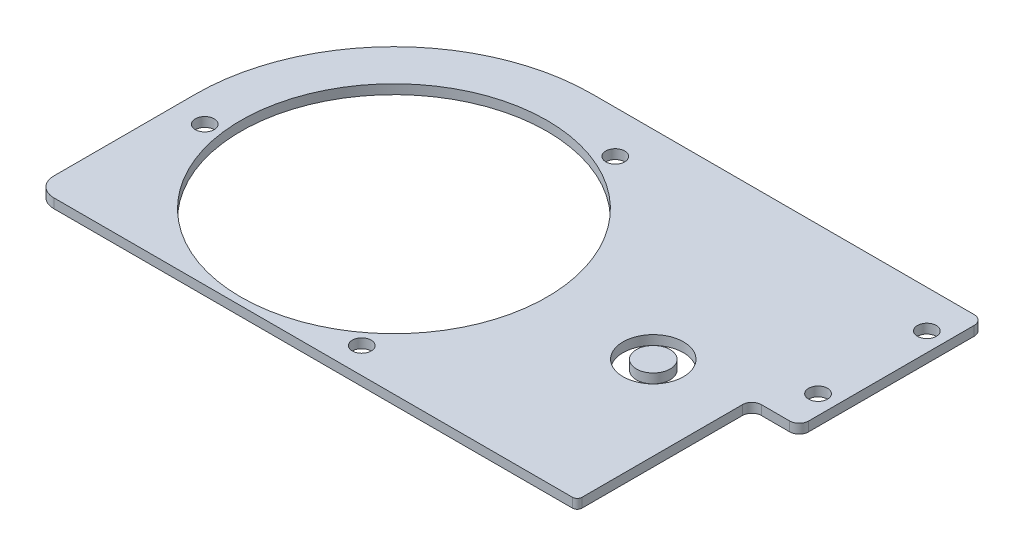
ISO-10303-21;
HEADER;
FILE_DESCRIPTION(('STEP AP214'),'2;1');
FILE_NAME('part.step','',(''),(''),'','','');
FILE_SCHEMA(('AUTOMOTIVE_DESIGN { 1 0 10303 214 1 1 1 1 }'));
ENDSEC;
DATA;
#1=APPLICATION_CONTEXT('core data for automotive mechanical design processes');
#2=APPLICATION_PROTOCOL_DEFINITION('international standard','automotive_design',2000,#1);
#3=PRODUCT_CONTEXT('',#1,'mechanical');
#4=PRODUCT('Part','Part','',(#3));
#5=PRODUCT_RELATED_PRODUCT_CATEGORY('part','',(#4));
#6=PRODUCT_DEFINITION_FORMATION('','',#4);
#7=PRODUCT_DEFINITION_CONTEXT('part definition',#1,'design');
#8=PRODUCT_DEFINITION('design','',#6,#7);
#9=PRODUCT_DEFINITION_SHAPE('','',#8);
#10=(LENGTH_UNIT() NAMED_UNIT(*) SI_UNIT(.MILLI.,.METRE.));
#11=(NAMED_UNIT(*) PLANE_ANGLE_UNIT() SI_UNIT($,.RADIAN.));
#12=(NAMED_UNIT(*) SI_UNIT($,.STERADIAN.) SOLID_ANGLE_UNIT());
#13=UNCERTAINTY_MEASURE_WITH_UNIT(LENGTH_MEASURE(1.E-05),#10,'distance_accuracy_value','');
#14=(GEOMETRIC_REPRESENTATION_CONTEXT(3) GLOBAL_UNCERTAINTY_ASSIGNED_CONTEXT((#13)) GLOBAL_UNIT_ASSIGNED_CONTEXT((#10,
#11,#12)) REPRESENTATION_CONTEXT('',''));
#15=CARTESIAN_POINT('',(0.,0.,0.));
#16=DIRECTION('',(0.,0.,1.));
#17=DIRECTION('',(1.,0.,0.));
#18=AXIS2_PLACEMENT_3D('',#15,#16,#17);
#19=CARTESIAN_POINT('',(-120.668920929197,6.35,95.2310790708027));
#20=DIRECTION('',(0.,-1.,0.));
#21=DIRECTION('',(0.,0.,-1.));
#22=AXIS2_PLACEMENT_3D('',#19,#20,#21);
#23=PLANE('',#22);
#24=CARTESIAN_POINT('',(68.8184042889801,6.35,90.4470456369459));
#25=DIRECTION('',(0.,1.,0.));
#26=DIRECTION('',(0.,0.,1.));
#27=AXIS2_PLACEMENT_3D('',#24,#25,#26);
#28=CIRCLE('',#27,6.35000000000515);
#29=CARTESIAN_POINT('',(68.8184042889801,6.35,96.7970456369511));
#30=VERTEX_POINT('',#29);
#31=EDGE_CURVE('E52',#30,#30,#28,.T.);
#32=ORIENTED_EDGE('',*,*,#31,.F.);
#33=EDGE_LOOP('',(#32));
#34=FACE_BOUND('',#33,.T.);
#35=CARTESIAN_POINT('',(43.9202370743556,6.35,-104.822009180638));
#36=DIRECTION('',(0.,1.,0.));
#37=DIRECTION('',(0.,0.,1.));
#38=AXIS2_PLACEMENT_3D('',#35,#36,#37);
#39=CIRCLE('',#38,6.35000000000716);
#40=CARTESIAN_POINT('',(43.9202370743556,6.35,-98.4720091806305));
#41=VERTEX_POINT('',#40);
#42=EDGE_CURVE('E188',#41,#41,#39,.T.);
#43=ORIENTED_EDGE('',*,*,#42,.F.);
#44=EDGE_LOOP('',(#43));
#45=FACE_BOUND('',#44,.T.);
#46=CARTESIAN_POINT('',(250.171079070803,6.35,-34.8507771089668));
#47=DIRECTION('',(0.,1.,0.));
#48=DIRECTION('',(0.,0.,1.));
#49=AXIS2_PLACEMENT_3D('',#46,#47,#48);
#50=CIRCLE('',#49,6.34999999999993);
#51=CARTESIAN_POINT('',(250.171079070803,6.35,-28.5007771089669));
#52=VERTEX_POINT('',#51);
#53=EDGE_CURVE('E182',#52,#52,#50,.T.);
#54=ORIENTED_EDGE('',*,*,#53,.F.);
#55=EDGE_LOOP('',(#54));
#56=FACE_BOUND('',#55,.T.);
#57=CARTESIAN_POINT('',(250.171079070803,6.35,-107.968920929197));
#58=DIRECTION('',(0.,1.,0.));
#59=DIRECTION('',(0.,0.,1.));
#60=AXIS2_PLACEMENT_3D('',#57,#58,#59);
#61=CIRCLE('',#60,6.34999999999999);
#62=CARTESIAN_POINT('',(250.171079070803,6.35,-101.618920929198));
#63=VERTEX_POINT('',#62);
#64=EDGE_CURVE('E176',#63,#63,#61,.T.);
#65=ORIENTED_EDGE('',*,*,#64,.F.);
#66=EDGE_LOOP('',(#65));
#67=FACE_BOUND('',#66,.T.);
#68=CARTESIAN_POINT('',(-112.738641363336,6.35,14.3749635436917));
#69=DIRECTION('',(0.,1.,0.));
#70=DIRECTION('',(0.,0.,1.));
#71=AXIS2_PLACEMENT_3D('',#68,#69,#70);
#72=CIRCLE('',#71,6.34999999998765);
#73=CARTESIAN_POINT('',(-112.738641363336,6.35,20.7249635436794));
#74=VERTEX_POINT('',#73);
#75=EDGE_CURVE('E169',#74,#74,#72,.T.);
#76=ORIENTED_EDGE('',*,*,#75,.F.);
#77=EDGE_LOOP('',(#76));
#78=FACE_BOUND('',#77,.T.);
#79=CARTESIAN_POINT('',(0.,6.35,0.));
#80=DIRECTION('',(0.,1.,0.));
#81=DIRECTION('',(0.,0.,1.));
#82=AXIS2_PLACEMENT_3D('',#79,#80,#81);
#83=CIRCLE('',#82,102.87);
#84=CARTESIAN_POINT('',(0.,6.35,102.87));
#85=VERTEX_POINT('',#84);
#86=EDGE_CURVE('E166',#85,#85,#83,.T.);
#87=ORIENTED_EDGE('',*,*,#86,.F.);
#88=EDGE_LOOP('',(#87));
#89=FACE_BOUND('',#88,.T.);
#90=CARTESIAN_POINT('',(-120.668920929197,6.35,95.2310790708027));
#91=DIRECTION('',(0.,1.,0.));
#92=DIRECTION('',(0.,0.,-1.));
#93=AXIS2_PLACEMENT_3D('',#90,#91,#92);
#94=CIRCLE('',#93,12.7);
#95=CARTESIAN_POINT('',(-133.368920929197,6.35,95.2310790708027));
#96=VERTEX_POINT('',#95);
#97=CARTESIAN_POINT('',(-120.668920929197,6.35,107.931079070803));
#98=VERTEX_POINT('',#97);
#99=EDGE_CURVE('E136',#96,#98,#94,.T.);
#100=ORIENTED_EDGE('',*,*,#99,.T.);
#101=DIRECTION('',(1.,0.,0.));
#102=VECTOR('',#101,1.);
#103=CARTESIAN_POINT('',(227.955539535401,6.35,107.931079070803));
#104=LINE('',#103,#102);
#105=CARTESIAN_POINT('',(227.955539535401,6.35,107.931079070803));
#106=VERTEX_POINT('',#105);
#107=EDGE_CURVE('E129',#98,#106,#104,.T.);
#108=ORIENTED_EDGE('',*,*,#107,.T.);
#109=CARTESIAN_POINT('',(227.955539535401,6.35,104.765539535401));
#110=DIRECTION('',(0.,1.,0.));
#111=DIRECTION('',(0.,0.,1.));
#112=AXIS2_PLACEMENT_3D('',#109,#110,#111);
#113=CIRCLE('',#112,3.16553953540139);
#114=CARTESIAN_POINT('',(231.121079070803,6.35,104.765539535401));
#115=VERTEX_POINT('',#114);
#116=EDGE_CURVE('E133',#106,#115,#113,.T.);
#117=ORIENTED_EDGE('',*,*,#116,.T.);
#118=DIRECTION('',(0.,0.,-1.));
#119=VECTOR('',#118,1.);
#120=CARTESIAN_POINT('',(231.121079070803,6.35,104.765539535401));
#121=LINE('',#120,#119);
#122=CARTESIAN_POINT('',(231.121079070803,6.35,-3.1007771089668));
#123=VERTEX_POINT('',#122);
#124=EDGE_CURVE('E154',#115,#123,#121,.T.);
#125=ORIENTED_EDGE('',*,*,#124,.T.);
#126=CARTESIAN_POINT('',(237.471079070803,6.35,-3.1007771089668));
#127=DIRECTION('',(0.,-1.,0.));
#128=DIRECTION('',(0.,0.,1.));
#129=AXIS2_PLACEMENT_3D('',#126,#127,#128);
#130=CIRCLE('',#129,6.35);
#131=CARTESIAN_POINT('',(237.471079070803,6.35,-9.4507771089668));
#132=VERTEX_POINT('',#131);
#133=EDGE_CURVE('E156',#123,#132,#130,.T.);
#134=ORIENTED_EDGE('',*,*,#133,.T.);
#135=DIRECTION('',(1.,0.,0.));
#136=VECTOR('',#135,1.);
#137=CARTESIAN_POINT('',(237.471079070803,6.35,-9.4507771089668));
#138=LINE('',#137,#136);
#139=CARTESIAN_POINT('',(256.521079070803,6.35,-9.4507771089668));
#140=VERTEX_POINT('',#139);
#141=EDGE_CURVE('E258',#132,#140,#138,.T.);
#142=ORIENTED_EDGE('',*,*,#141,.T.);
#143=CARTESIAN_POINT('',(256.521079070803,6.35,-15.8007771089668));
#144=DIRECTION('',(0.,1.,0.));
#145=DIRECTION('',(0.,0.,-1.));
#146=AXIS2_PLACEMENT_3D('',#143,#144,#145);
#147=CIRCLE('',#146,6.35000000000001);
#148=CARTESIAN_POINT('',(262.871079070803,6.35,-15.8007771089668));
#149=VERTEX_POINT('',#148);
#150=EDGE_CURVE('E256',#140,#149,#147,.T.);
#151=ORIENTED_EDGE('',*,*,#150,.T.);
#152=DIRECTION('',(0.,0.,-1.));
#153=VECTOR('',#152,1.);
#154=CARTESIAN_POINT('',(262.871079070803,6.35,-127.018920929198));
#155=LINE('',#154,#153);
#156=CARTESIAN_POINT('',(262.871079070803,6.35,-127.018920929198));
#157=VERTEX_POINT('',#156);
#158=EDGE_CURVE('E254',#149,#157,#155,.T.);
#159=ORIENTED_EDGE('',*,*,#158,.T.);
#160=CARTESIAN_POINT('',(256.521079070803,6.35,-127.018920929198));
#161=DIRECTION('',(0.,1.,0.));
#162=DIRECTION('',(0.,0.,-1.));
#163=AXIS2_PLACEMENT_3D('',#160,#161,#162);
#164=CIRCLE('',#163,6.34999999999997);
#165=CARTESIAN_POINT('',(256.521079070803,6.35,-133.368920929197));
#166=VERTEX_POINT('',#165);
#167=EDGE_CURVE('E252',#157,#166,#164,.T.);
#168=ORIENTED_EDGE('',*,*,#167,.T.);
#169=DIRECTION('',(-1.,0.,0.));
#170=VECTOR('',#169,1.);
#171=CARTESIAN_POINT('',(256.521079070803,6.35,-133.368920929197));
#172=LINE('',#171,#170);
#173=CARTESIAN_POINT('',(0.,6.35,-133.368920929197));
#174=VERTEX_POINT('',#173);
#175=EDGE_CURVE('E250',#166,#174,#172,.T.);
#176=ORIENTED_EDGE('',*,*,#175,.T.);
#177=CARTESIAN_POINT('',(0.,6.35,0.));
#178=DIRECTION('',(0.,1.,0.));
#179=DIRECTION('',(0.,0.,-1.));
#180=AXIS2_PLACEMENT_3D('',#177,#178,#179);
#181=CIRCLE('',#180,133.368920929197);
#182=CARTESIAN_POINT('',(-133.368920929197,6.35,0.));
#183=VERTEX_POINT('',#182);
#184=EDGE_CURVE('E248',#174,#183,#181,.T.);
#185=ORIENTED_EDGE('',*,*,#184,.T.);
#186=DIRECTION('',(0.,0.,1.));
#187=VECTOR('',#186,1.);
#188=CARTESIAN_POINT('',(-133.368920929197,6.35,0.));
#189=LINE('',#188,#187);
#190=EDGE_CURVE('E191',#183,#96,#189,.T.);
#191=ORIENTED_EDGE('',*,*,#190,.T.);
#192=EDGE_LOOP('',(#100,#108,#117,#125,#134,#142,#151,#159,#168,#176,#185,#191));
#193=FACE_BOUND('',#192,.T.);
#194=CARTESIAN_POINT('',(174.751369452698,6.35,0.46944478550498));
#195=DIRECTION('',(0.,-1.,0.));
#196=DIRECTION('',(0.,0.,-1.));
#197=AXIS2_PLACEMENT_3D('',#194,#195,#196);
#198=CIRCLE('',#197,20.32);
#199=CARTESIAN_POINT('',(174.751369452698,6.35,-19.850555214495));
#200=VERTEX_POINT('',#199);
#201=EDGE_CURVE('E12',#200,#200,#198,.F.);
#202=ORIENTED_EDGE('',*,*,#201,.F.);
#203=EDGE_LOOP('',(#202));
#204=FACE_BOUND('',#203,.T.);
#205=ADVANCED_FACE('F43',(#34,#45,#56,#67,#78,#89,#193,#204),#23,.F.);
#206=CARTESIAN_POINT('',(-120.668920929197,0.,95.2310790708027));
#207=DIRECTION('',(0.,-1.,0.));
#208=DIRECTION('',(0.,0.,-1.));
#209=AXIS2_PLACEMENT_3D('',#206,#207,#208);
#210=PLANE('',#209);
#211=CARTESIAN_POINT('',(43.9202370743556,0.,-104.822009180638));
#212=DIRECTION('',(0.,1.,0.));
#213=DIRECTION('',(0.,0.,1.));
#214=AXIS2_PLACEMENT_3D('',#211,#212,#213);
#215=CIRCLE('',#214,6.35000000000716);
#216=CARTESIAN_POINT('',(43.9202370743556,0.,-98.4720091806305));
#217=VERTEX_POINT('',#216);
#218=EDGE_CURVE('E179',#217,#217,#215,.T.);
#219=ORIENTED_EDGE('',*,*,#218,.T.);
#220=EDGE_LOOP('',(#219));
#221=FACE_BOUND('',#220,.T.);
#222=CARTESIAN_POINT('',(250.171079070803,0.,-107.968920929197));
#223=DIRECTION('',(0.,1.,0.));
#224=DIRECTION('',(0.,0.,1.));
#225=AXIS2_PLACEMENT_3D('',#222,#223,#224);
#226=CIRCLE('',#225,6.34999999999999);
#227=CARTESIAN_POINT('',(250.171079070803,0.,-101.618920929198));
#228=VERTEX_POINT('',#227);
#229=EDGE_CURVE('E165',#228,#228,#226,.T.);
#230=ORIENTED_EDGE('',*,*,#229,.T.);
#231=EDGE_LOOP('',(#230));
#232=FACE_BOUND('',#231,.T.);
#233=CARTESIAN_POINT('',(0.,0.,0.));
#234=DIRECTION('',(0.,1.,0.));
#235=DIRECTION('',(0.,0.,1.));
#236=AXIS2_PLACEMENT_3D('',#233,#234,#235);
#237=CIRCLE('',#236,102.87);
#238=CARTESIAN_POINT('',(0.,0.,102.87));
#239=VERTEX_POINT('',#238);
#240=EDGE_CURVE('E161',#239,#239,#237,.T.);
#241=ORIENTED_EDGE('',*,*,#240,.T.);
#242=EDGE_LOOP('',(#241));
#243=FACE_BOUND('',#242,.T.);
#244=CARTESIAN_POINT('',(-120.668920929197,0.,95.2310790708027));
#245=DIRECTION('',(0.,1.,0.));
#246=DIRECTION('',(0.,0.,-1.));
#247=AXIS2_PLACEMENT_3D('',#244,#245,#246);
#248=CIRCLE('',#247,12.7);
#249=CARTESIAN_POINT('',(-133.368920929197,0.,95.2310790708027));
#250=VERTEX_POINT('',#249);
#251=CARTESIAN_POINT('',(-120.668920929197,0.,107.931079070803));
#252=VERTEX_POINT('',#251);
#253=EDGE_CURVE('E230',#250,#252,#248,.T.);
#254=ORIENTED_EDGE('',*,*,#253,.F.);
#255=DIRECTION('',(0.,0.,1.));
#256=VECTOR('',#255,1.);
#257=CARTESIAN_POINT('',(-133.368920929197,0.,0.));
#258=LINE('',#257,#256);
#259=CARTESIAN_POINT('',(-133.368920929197,0.,0.));
#260=VERTEX_POINT('',#259);
#261=EDGE_CURVE('E60',#260,#250,#258,.T.);
#262=ORIENTED_EDGE('',*,*,#261,.F.);
#263=CARTESIAN_POINT('',(0.,0.,0.));
#264=DIRECTION('',(0.,1.,0.));
#265=DIRECTION('',(0.,0.,-1.));
#266=AXIS2_PLACEMENT_3D('',#263,#264,#265);
#267=CIRCLE('',#266,133.368920929197);
#268=CARTESIAN_POINT('',(0.,0.,-133.368920929197));
#269=VERTEX_POINT('',#268);
#270=EDGE_CURVE('E308',#269,#260,#267,.T.);
#271=ORIENTED_EDGE('',*,*,#270,.F.);
#272=DIRECTION('',(-1.,0.,0.));
#273=VECTOR('',#272,1.);
#274=CARTESIAN_POINT('',(256.521079070803,0.,-133.368920929197));
#275=LINE('',#274,#273);
#276=CARTESIAN_POINT('',(256.521079070803,0.,-133.368920929197));
#277=VERTEX_POINT('',#276);
#278=EDGE_CURVE('E299',#277,#269,#275,.T.);
#279=ORIENTED_EDGE('',*,*,#278,.F.);
#280=CARTESIAN_POINT('',(256.521079070803,0.,-127.018920929198));
#281=DIRECTION('',(0.,1.,0.));
#282=DIRECTION('',(0.,0.,-1.));
#283=AXIS2_PLACEMENT_3D('',#280,#281,#282);
#284=CIRCLE('',#283,6.34999999999997);
#285=CARTESIAN_POINT('',(262.871079070803,0.,-127.018920929198));
#286=VERTEX_POINT('',#285);
#287=EDGE_CURVE('E300',#286,#277,#284,.T.);
#288=ORIENTED_EDGE('',*,*,#287,.F.);
#289=DIRECTION('',(0.,0.,-1.));
#290=VECTOR('',#289,1.);
#291=CARTESIAN_POINT('',(262.871079070803,0.,-127.018920929198));
#292=LINE('',#291,#290);
#293=CARTESIAN_POINT('',(262.871079070803,0.,-15.8007771089668));
#294=VERTEX_POINT('',#293);
#295=EDGE_CURVE('E282',#294,#286,#292,.T.);
#296=ORIENTED_EDGE('',*,*,#295,.F.);
#297=CARTESIAN_POINT('',(256.521079070803,0.,-15.8007771089668));
#298=DIRECTION('',(0.,1.,0.));
#299=DIRECTION('',(0.,0.,-1.));
#300=AXIS2_PLACEMENT_3D('',#297,#298,#299);
#301=CIRCLE('',#300,6.35000000000001);
#302=CARTESIAN_POINT('',(256.521079070803,0.,-9.4507771089668));
#303=VERTEX_POINT('',#302);
#304=EDGE_CURVE('E273',#303,#294,#301,.T.);
#305=ORIENTED_EDGE('',*,*,#304,.F.);
#306=DIRECTION('',(1.,0.,0.));
#307=VECTOR('',#306,1.);
#308=CARTESIAN_POINT('',(237.471079070803,0.,-9.4507771089668));
#309=LINE('',#308,#307);
#310=CARTESIAN_POINT('',(237.471079070803,0.,-9.4507771089668));
#311=VERTEX_POINT('',#310);
#312=EDGE_CURVE('E274',#311,#303,#309,.T.);
#313=ORIENTED_EDGE('',*,*,#312,.F.);
#314=CARTESIAN_POINT('',(237.471079070803,0.,-3.1007771089668));
#315=DIRECTION('',(0.,-1.,0.));
#316=DIRECTION('',(0.,0.,1.));
#317=AXIS2_PLACEMENT_3D('',#314,#315,#316);
#318=CIRCLE('',#317,6.35);
#319=CARTESIAN_POINT('',(231.121079070803,0.,-3.1007771089668));
#320=VERTEX_POINT('',#319);
#321=EDGE_CURVE('E270',#320,#311,#318,.T.);
#322=ORIENTED_EDGE('',*,*,#321,.F.);
#323=DIRECTION('',(0.,0.,-1.));
#324=VECTOR('',#323,1.);
#325=CARTESIAN_POINT('',(231.121079070803,0.,104.765539535401));
#326=LINE('',#325,#324);
#327=CARTESIAN_POINT('',(231.121079070803,0.,104.765539535401));
#328=VERTEX_POINT('',#327);
#329=EDGE_CURVE('E147',#328,#320,#326,.T.);
#330=ORIENTED_EDGE('',*,*,#329,.F.);
#331=CARTESIAN_POINT('',(227.955539535401,0.,104.765539535401));
#332=DIRECTION('',(0.,1.,0.));
#333=DIRECTION('',(0.,0.,1.));
#334=AXIS2_PLACEMENT_3D('',#331,#332,#333);
#335=CIRCLE('',#334,3.16553953540139);
#336=CARTESIAN_POINT('',(227.955539535401,0.,107.931079070803));
#337=VERTEX_POINT('',#336);
#338=EDGE_CURVE('E148',#337,#328,#335,.T.);
#339=ORIENTED_EDGE('',*,*,#338,.F.);
#340=DIRECTION('',(1.,0.,0.));
#341=VECTOR('',#340,1.);
#342=CARTESIAN_POINT('',(227.955539535401,0.,107.931079070803));
#343=LINE('',#342,#341);
#344=EDGE_CURVE('E144',#252,#337,#343,.T.);
#345=ORIENTED_EDGE('',*,*,#344,.F.);
#346=EDGE_LOOP('',(#254,#262,#271,#279,#288,#296,#305,#313,#322,#330,#339,#345));
#347=FACE_BOUND('',#346,.T.);
#348=CARTESIAN_POINT('',(-112.738641363336,0.,14.3749635436917));
#349=DIRECTION('',(0.,1.,0.));
#350=DIRECTION('',(0.,0.,1.));
#351=AXIS2_PLACEMENT_3D('',#348,#349,#350);
#352=CIRCLE('',#351,6.34999999998765);
#353=CARTESIAN_POINT('',(-112.738641363336,0.,20.7249635436794));
#354=VERTEX_POINT('',#353);
#355=EDGE_CURVE('E164',#354,#354,#352,.T.);
#356=ORIENTED_EDGE('',*,*,#355,.T.);
#357=EDGE_LOOP('',(#356));
#358=FACE_BOUND('',#357,.T.);
#359=CARTESIAN_POINT('',(250.171079070803,0.,-34.8507771089668));
#360=DIRECTION('',(0.,1.,0.));
#361=DIRECTION('',(0.,0.,1.));
#362=AXIS2_PLACEMENT_3D('',#359,#360,#361);
#363=CIRCLE('',#362,6.34999999999993);
#364=CARTESIAN_POINT('',(250.171079070803,0.,-28.5007771089669));
#365=VERTEX_POINT('',#364);
#366=EDGE_CURVE('E173',#365,#365,#363,.T.);
#367=ORIENTED_EDGE('',*,*,#366,.T.);
#368=EDGE_LOOP('',(#367));
#369=FACE_BOUND('',#368,.T.);
#370=CARTESIAN_POINT('',(68.8184042889801,0.,90.4470456369459));
#371=DIRECTION('',(0.,1.,0.));
#372=DIRECTION('',(0.,0.,1.));
#373=AXIS2_PLACEMENT_3D('',#370,#371,#372);
#374=CIRCLE('',#373,6.35000000000515);
#375=CARTESIAN_POINT('',(68.8184042889801,0.,96.7970456369511));
#376=VERTEX_POINT('',#375);
#377=EDGE_CURVE('E185',#376,#376,#374,.T.);
#378=ORIENTED_EDGE('',*,*,#377,.T.);
#379=EDGE_LOOP('',(#378));
#380=FACE_BOUND('',#379,.T.);
#381=CARTESIAN_POINT('',(174.751369452698,0.,0.46944478550498));
#382=DIRECTION('',(0.,1.,0.));
#383=DIRECTION('',(0.,0.,1.));
#384=AXIS2_PLACEMENT_3D('',#381,#382,#383);
#385=CIRCLE('',#384,20.32);
#386=CARTESIAN_POINT('',(174.751369452698,0.,20.789444785505));
#387=VERTEX_POINT('',#386);
#388=EDGE_CURVE('E46',#387,#387,#385,.T.);
#389=ORIENTED_EDGE('',*,*,#388,.T.);
#390=EDGE_LOOP('',(#389));
#391=FACE_BOUND('',#390,.T.);
#392=ADVANCED_FACE('F204',(#221,#232,#243,#347,#358,#369,#380,#391),#210,.T.);
#393=CARTESIAN_POINT('',(-120.668920929197,6.35,95.2310790708027));
#394=DIRECTION('',(0.,-1.,0.));
#395=DIRECTION('',(0.,0.,-1.));
#396=AXIS2_PLACEMENT_3D('',#393,#394,#395);
#397=CYLINDRICAL_SURFACE('',#396,12.7);
#398=ORIENTED_EDGE('',*,*,#253,.T.);
#399=DIRECTION('',(0.,-1.,0.));
#400=VECTOR('',#399,1.);
#401=CARTESIAN_POINT('',(-120.668920929197,6.35,107.931079070803));
#402=LINE('',#401,#400);
#403=EDGE_CURVE('E321',#98,#252,#402,.T.);
#404=ORIENTED_EDGE('',*,*,#403,.F.);
#405=ORIENTED_EDGE('',*,*,#99,.F.);
#406=DIRECTION('',(0.,-1.,0.));
#407=VECTOR('',#406,1.);
#408=CARTESIAN_POINT('',(-133.368920929197,6.35,95.2310790708027));
#409=LINE('',#408,#407);
#410=EDGE_CURVE('E240',#96,#250,#409,.T.);
#411=ORIENTED_EDGE('',*,*,#410,.T.);
#412=EDGE_LOOP('',(#398,#404,#405,#411));
#413=FACE_BOUND('',#412,.T.);
#414=ADVANCED_FACE('F225',(#413),#397,.T.);
#415=CARTESIAN_POINT('',(227.955539535401,6.35,107.931079070803));
#416=DIRECTION('',(0.,0.,-1.));
#417=DIRECTION('',(-1.,0.,0.));
#418=AXIS2_PLACEMENT_3D('',#415,#416,#417);
#419=PLANE('',#418);
#420=ORIENTED_EDGE('',*,*,#344,.T.);
#421=DIRECTION('',(0.,-1.,0.));
#422=VECTOR('',#421,1.);
#423=CARTESIAN_POINT('',(227.955539535401,6.35,107.931079070803));
#424=LINE('',#423,#422);
#425=EDGE_CURVE('E142',#106,#337,#424,.T.);
#426=ORIENTED_EDGE('',*,*,#425,.F.);
#427=ORIENTED_EDGE('',*,*,#107,.F.);
#428=ORIENTED_EDGE('',*,*,#403,.T.);
#429=EDGE_LOOP('',(#420,#426,#427,#428));
#430=FACE_BOUND('',#429,.T.);
#431=ADVANCED_FACE('F143',(#430),#419,.F.);
#432=CARTESIAN_POINT('',(227.955539535401,6.35,104.765539535401));
#433=DIRECTION('',(0.,-1.,0.));
#434=DIRECTION('',(0.,0.,-1.));
#435=AXIS2_PLACEMENT_3D('',#432,#433,#434);
#436=CYLINDRICAL_SURFACE('',#435,3.16553953540139);
#437=ORIENTED_EDGE('',*,*,#338,.T.);
#438=DIRECTION('',(0.,-1.,0.));
#439=VECTOR('',#438,1.);
#440=CARTESIAN_POINT('',(231.121079070803,6.35,104.765539535401));
#441=LINE('',#440,#439);
#442=EDGE_CURVE('E152',#115,#328,#441,.T.);
#443=ORIENTED_EDGE('',*,*,#442,.F.);
#444=ORIENTED_EDGE('',*,*,#116,.F.);
#445=ORIENTED_EDGE('',*,*,#425,.T.);
#446=EDGE_LOOP('',(#437,#443,#444,#445));
#447=FACE_BOUND('',#446,.T.);
#448=ADVANCED_FACE('F150',(#447),#436,.T.);
#449=CARTESIAN_POINT('',(231.121079070803,6.35,104.765539535401));
#450=DIRECTION('',(-1.,0.,0.));
#451=DIRECTION('',(0.,0.,1.));
#452=AXIS2_PLACEMENT_3D('',#449,#450,#451);
#453=PLANE('',#452);
#454=ORIENTED_EDGE('',*,*,#329,.T.);
#455=DIRECTION('',(0.,-1.,0.));
#456=VECTOR('',#455,1.);
#457=CARTESIAN_POINT('',(231.121079070803,6.35,-3.1007771089668));
#458=LINE('',#457,#456);
#459=EDGE_CURVE('E325',#123,#320,#458,.T.);
#460=ORIENTED_EDGE('',*,*,#459,.F.);
#461=ORIENTED_EDGE('',*,*,#124,.F.);
#462=ORIENTED_EDGE('',*,*,#442,.T.);
#463=EDGE_LOOP('',(#454,#460,#461,#462));
#464=FACE_BOUND('',#463,.T.);
#465=ADVANCED_FACE('F339',(#464),#453,.F.);
#466=CARTESIAN_POINT('',(237.471079070803,6.35,-3.1007771089668));
#467=DIRECTION('',(0.,-1.,0.));
#468=DIRECTION('',(0.,0.,-1.));
#469=AXIS2_PLACEMENT_3D('',#466,#467,#468);
#470=CYLINDRICAL_SURFACE('',#469,6.35);
#471=ORIENTED_EDGE('',*,*,#321,.T.);
#472=DIRECTION('',(0.,-1.,0.));
#473=VECTOR('',#472,1.);
#474=CARTESIAN_POINT('',(237.471079070803,6.35,-9.4507771089668));
#475=LINE('',#474,#473);
#476=EDGE_CURVE('E267',#132,#311,#475,.T.);
#477=ORIENTED_EDGE('',*,*,#476,.F.);
#478=ORIENTED_EDGE('',*,*,#133,.F.);
#479=ORIENTED_EDGE('',*,*,#459,.T.);
#480=EDGE_LOOP('',(#471,#477,#478,#479));
#481=FACE_BOUND('',#480,.T.);
#482=ADVANCED_FACE('F268',(#481),#470,.F.);
#483=CARTESIAN_POINT('',(237.471079070803,6.35,-9.4507771089668));
#484=DIRECTION('',(0.,0.,-1.));
#485=DIRECTION('',(-1.,0.,0.));
#486=AXIS2_PLACEMENT_3D('',#483,#484,#485);
#487=PLANE('',#486);
#488=ORIENTED_EDGE('',*,*,#312,.T.);
#489=DIRECTION('',(0.,-1.,0.));
#490=VECTOR('',#489,1.);
#491=CARTESIAN_POINT('',(256.521079070803,6.35,-9.4507771089668));
#492=LINE('',#491,#490);
#493=EDGE_CURVE('E278',#140,#303,#492,.T.);
#494=ORIENTED_EDGE('',*,*,#493,.F.);
#495=ORIENTED_EDGE('',*,*,#141,.F.);
#496=ORIENTED_EDGE('',*,*,#476,.T.);
#497=EDGE_LOOP('',(#488,#494,#495,#496));
#498=FACE_BOUND('',#497,.T.);
#499=ADVANCED_FACE('F276',(#498),#487,.F.);
#500=CARTESIAN_POINT('',(256.521079070803,6.35,-15.8007771089668));
#501=DIRECTION('',(0.,-1.,0.));
#502=DIRECTION('',(0.,0.,-1.));
#503=AXIS2_PLACEMENT_3D('',#500,#501,#502);
#504=CYLINDRICAL_SURFACE('',#503,6.35000000000001);
#505=ORIENTED_EDGE('',*,*,#304,.T.);
#506=DIRECTION('',(0.,-1.,0.));
#507=VECTOR('',#506,1.);
#508=CARTESIAN_POINT('',(262.871079070803,6.35,-15.8007771089668));
#509=LINE('',#508,#507);
#510=EDGE_CURVE('E287',#149,#294,#509,.T.);
#511=ORIENTED_EDGE('',*,*,#510,.F.);
#512=ORIENTED_EDGE('',*,*,#150,.F.);
#513=ORIENTED_EDGE('',*,*,#493,.T.);
#514=EDGE_LOOP('',(#505,#511,#512,#513));
#515=FACE_BOUND('',#514,.T.);
#516=ADVANCED_FACE('F285',(#515),#504,.T.);
#517=CARTESIAN_POINT('',(262.871079070803,6.35,-127.018920929198));
#518=DIRECTION('',(-1.,0.,0.));
#519=DIRECTION('',(0.,0.,1.));
#520=AXIS2_PLACEMENT_3D('',#517,#518,#519);
#521=PLANE('',#520);
#522=ORIENTED_EDGE('',*,*,#295,.T.);
#523=DIRECTION('',(0.,-1.,0.));
#524=VECTOR('',#523,1.);
#525=CARTESIAN_POINT('',(262.871079070803,6.35,-127.018920929198));
#526=LINE('',#525,#524);
#527=EDGE_CURVE('E294',#157,#286,#526,.T.);
#528=ORIENTED_EDGE('',*,*,#527,.F.);
#529=ORIENTED_EDGE('',*,*,#158,.F.);
#530=ORIENTED_EDGE('',*,*,#510,.T.);
#531=EDGE_LOOP('',(#522,#528,#529,#530));
#532=FACE_BOUND('',#531,.T.);
#533=ADVANCED_FACE('F295',(#532),#521,.F.);
#534=CARTESIAN_POINT('',(256.521079070803,6.35,-127.018920929198));
#535=DIRECTION('',(0.,-1.,0.));
#536=DIRECTION('',(0.,0.,-1.));
#537=AXIS2_PLACEMENT_3D('',#534,#535,#536);
#538=CYLINDRICAL_SURFACE('',#537,6.34999999999997);
#539=ORIENTED_EDGE('',*,*,#287,.T.);
#540=DIRECTION('',(0.,-1.,0.));
#541=VECTOR('',#540,1.);
#542=CARTESIAN_POINT('',(256.521079070803,6.35,-133.368920929197));
#543=LINE('',#542,#541);
#544=EDGE_CURVE('E304',#166,#277,#543,.T.);
#545=ORIENTED_EDGE('',*,*,#544,.F.);
#546=ORIENTED_EDGE('',*,*,#167,.F.);
#547=ORIENTED_EDGE('',*,*,#527,.T.);
#548=EDGE_LOOP('',(#539,#545,#546,#547));
#549=FACE_BOUND('',#548,.T.);
#550=ADVANCED_FACE('F302',(#549),#538,.T.);
#551=CARTESIAN_POINT('',(256.521079070803,6.35,-133.368920929197));
#552=DIRECTION('',(0.,0.,1.));
#553=DIRECTION('',(1.,0.,0.));
#554=AXIS2_PLACEMENT_3D('',#551,#552,#553);
#555=PLANE('',#554);
#556=ORIENTED_EDGE('',*,*,#278,.T.);
#557=DIRECTION('',(0.,-1.,0.));
#558=VECTOR('',#557,1.);
#559=CARTESIAN_POINT('',(0.,6.35,-133.368920929197));
#560=LINE('',#559,#558);
#561=EDGE_CURVE('E313',#174,#269,#560,.T.);
#562=ORIENTED_EDGE('',*,*,#561,.F.);
#563=ORIENTED_EDGE('',*,*,#175,.F.);
#564=ORIENTED_EDGE('',*,*,#544,.T.);
#565=EDGE_LOOP('',(#556,#562,#563,#564));
#566=FACE_BOUND('',#565,.T.);
#567=ADVANCED_FACE('F311',(#566),#555,.F.);
#568=CARTESIAN_POINT('',(0.,6.35,0.));
#569=DIRECTION('',(0.,-1.,0.));
#570=DIRECTION('',(0.,0.,-1.));
#571=AXIS2_PLACEMENT_3D('',#568,#569,#570);
#572=CYLINDRICAL_SURFACE('',#571,133.368920929197);
#573=ORIENTED_EDGE('',*,*,#270,.T.);
#574=DIRECTION('',(0.,-1.,0.));
#575=VECTOR('',#574,1.);
#576=CARTESIAN_POINT('',(-133.368920929197,6.35,0.));
#577=LINE('',#576,#575);
#578=EDGE_CURVE('E170',#183,#260,#577,.T.);
#579=ORIENTED_EDGE('',*,*,#578,.F.);
#580=ORIENTED_EDGE('',*,*,#184,.F.);
#581=ORIENTED_EDGE('',*,*,#561,.T.);
#582=EDGE_LOOP('',(#573,#579,#580,#581));
#583=FACE_BOUND('',#582,.T.);
#584=ADVANCED_FACE('F318',(#583),#572,.T.);
#585=CARTESIAN_POINT('',(-133.368920929197,6.35,0.));
#586=DIRECTION('',(1.,0.,0.));
#587=DIRECTION('',(0.,0.,-1.));
#588=AXIS2_PLACEMENT_3D('',#585,#586,#587);
#589=PLANE('',#588);
#590=ORIENTED_EDGE('',*,*,#261,.T.);
#591=ORIENTED_EDGE('',*,*,#410,.F.);
#592=ORIENTED_EDGE('',*,*,#190,.F.);
#593=ORIENTED_EDGE('',*,*,#578,.T.);
#594=EDGE_LOOP('',(#590,#591,#592,#593));
#595=FACE_BOUND('',#594,.T.);
#596=ADVANCED_FACE('F219',(#595),#589,.F.);
#597=CARTESIAN_POINT('',(0.,6.35,0.));
#598=DIRECTION('',(0.,-1.,0.));
#599=DIRECTION('',(0.,0.,-1.));
#600=AXIS2_PLACEMENT_3D('',#597,#598,#599);
#601=CYLINDRICAL_SURFACE('',#600,102.87);
#602=ORIENTED_EDGE('',*,*,#86,.T.);
#603=EDGE_LOOP('',(#602));
#604=FACE_BOUND('',#603,.T.);
#605=ORIENTED_EDGE('',*,*,#240,.F.);
#606=EDGE_LOOP('',(#605));
#607=FACE_BOUND('',#606,.T.);
#608=ADVANCED_FACE('F215',(#604,#607),#601,.F.);
#609=CARTESIAN_POINT('',(-112.738641363336,6.35,14.3749635436917));
#610=DIRECTION('',(0.,-1.,0.));
#611=DIRECTION('',(0.,0.,-1.));
#612=AXIS2_PLACEMENT_3D('',#609,#610,#611);
#613=CYLINDRICAL_SURFACE('',#612,6.34999999998765);
#614=ORIENTED_EDGE('',*,*,#75,.T.);
#615=EDGE_LOOP('',(#614));
#616=FACE_BOUND('',#615,.T.);
#617=ORIENTED_EDGE('',*,*,#355,.F.);
#618=EDGE_LOOP('',(#617));
#619=FACE_BOUND('',#618,.T.);
#620=ADVANCED_FACE('F218',(#616,#619),#613,.F.);
#621=CARTESIAN_POINT('',(250.171079070803,6.35,-107.968920929197));
#622=DIRECTION('',(0.,-1.,0.));
#623=DIRECTION('',(0.,0.,-1.));
#624=AXIS2_PLACEMENT_3D('',#621,#622,#623);
#625=CYLINDRICAL_SURFACE('',#624,6.34999999999999);
#626=ORIENTED_EDGE('',*,*,#64,.T.);
#627=EDGE_LOOP('',(#626));
#628=FACE_BOUND('',#627,.T.);
#629=ORIENTED_EDGE('',*,*,#229,.F.);
#630=EDGE_LOOP('',(#629));
#631=FACE_BOUND('',#630,.T.);
#632=ADVANCED_FACE('F366',(#628,#631),#625,.F.);
#633=CARTESIAN_POINT('',(250.171079070803,6.35,-34.8507771089668));
#634=DIRECTION('',(0.,-1.,0.));
#635=DIRECTION('',(0.,0.,-1.));
#636=AXIS2_PLACEMENT_3D('',#633,#634,#635);
#637=CYLINDRICAL_SURFACE('',#636,6.34999999999993);
#638=ORIENTED_EDGE('',*,*,#53,.T.);
#639=EDGE_LOOP('',(#638));
#640=FACE_BOUND('',#639,.T.);
#641=ORIENTED_EDGE('',*,*,#366,.F.);
#642=EDGE_LOOP('',(#641));
#643=FACE_BOUND('',#642,.T.);
#644=ADVANCED_FACE('F370',(#640,#643),#637,.F.);
#645=CARTESIAN_POINT('',(43.9202370743556,6.35,-104.822009180638));
#646=DIRECTION('',(0.,-1.,0.));
#647=DIRECTION('',(0.,0.,-1.));
#648=AXIS2_PLACEMENT_3D('',#645,#646,#647);
#649=CYLINDRICAL_SURFACE('',#648,6.35000000000716);
#650=ORIENTED_EDGE('',*,*,#42,.T.);
#651=EDGE_LOOP('',(#650));
#652=FACE_BOUND('',#651,.T.);
#653=ORIENTED_EDGE('',*,*,#218,.F.);
#654=EDGE_LOOP('',(#653));
#655=FACE_BOUND('',#654,.T.);
#656=ADVANCED_FACE('F374',(#652,#655),#649,.F.);
#657=CARTESIAN_POINT('',(68.8184042889801,6.35,90.4470456369459));
#658=DIRECTION('',(0.,-1.,0.));
#659=DIRECTION('',(0.,0.,-1.));
#660=AXIS2_PLACEMENT_3D('',#657,#658,#659);
#661=CYLINDRICAL_SURFACE('',#660,6.35000000000515);
#662=ORIENTED_EDGE('',*,*,#31,.T.);
#663=EDGE_LOOP('',(#662));
#664=FACE_BOUND('',#663,.T.);
#665=ORIENTED_EDGE('',*,*,#377,.F.);
#666=EDGE_LOOP('',(#665));
#667=FACE_BOUND('',#666,.T.);
#668=ADVANCED_FACE('F199',(#664,#667),#661,.F.);
#669=CARTESIAN_POINT('',(174.751369452698,28.448,0.46944478550498));
#670=DIRECTION('',(0.,-1.,0.));
#671=DIRECTION('',(0.,0.,-1.));
#672=AXIS2_PLACEMENT_3D('',#669,#670,#671);
#673=CYLINDRICAL_SURFACE('',#672,20.32);
#674=ORIENTED_EDGE('',*,*,#388,.F.);
#675=EDGE_LOOP('',(#674));
#676=FACE_BOUND('',#675,.T.);
#677=ORIENTED_EDGE('',*,*,#201,.T.);
#678=EDGE_LOOP('',(#677));
#679=FACE_BOUND('',#678,.T.);
#680=ADVANCED_FACE('F381',(#676,#679),#673,.F.);
#681=CLOSED_SHELL('',(#205,#392,#414,#431,#448,#465,#482,#499,#516,#533,#550,#567,#584,#596,
#608,#620,#632,#644,#656,#668,#680));
#682=MANIFOLD_SOLID_BREP('B2',#681);
#683=CARTESIAN_POINT('',(-120.668920929197,0.,95.2310790708027));
#684=DIRECTION('',(0.,-1.,0.));
#685=DIRECTION('',(0.,0.,-1.));
#686=AXIS2_PLACEMENT_3D('',#683,#684,#685);
#687=PLANE('',#686);
#688=CARTESIAN_POINT('',(174.751369452698,0.,0.46944478550498));
#689=DIRECTION('',(0.,1.,0.));
#690=DIRECTION('',(0.,0.,1.));
#691=AXIS2_PLACEMENT_3D('',#688,#689,#690);
#692=CIRCLE('',#691,11.3227513432342);
#693=CARTESIAN_POINT('',(174.751369452698,0.,11.7921961287392));
#694=VERTEX_POINT('',#693);
#695=EDGE_CURVE('E540',#694,#694,#692,.T.);
#696=ORIENTED_EDGE('',*,*,#695,.F.);
#697=EDGE_LOOP('',(#696));
#698=FACE_BOUND('',#697,.T.);
#699=ADVANCED_FACE('F534',(#698),#687,.T.);
#700=CARTESIAN_POINT('',(174.751369452698,28.448,0.46944478550498));
#701=DIRECTION('',(0.,-1.,0.));
#702=DIRECTION('',(0.,0.,-1.));
#703=AXIS2_PLACEMENT_3D('',#700,#701,#702);
#704=CYLINDRICAL_SURFACE('',#703,11.3227513432342);
#705=ORIENTED_EDGE('',*,*,#695,.T.);
#706=EDGE_LOOP('',(#705));
#707=FACE_BOUND('',#706,.T.);
#708=CARTESIAN_POINT('',(174.751369452698,6.35,0.46944478550498));
#709=DIRECTION('',(0.,-1.,0.));
#710=DIRECTION('',(0.,0.,-1.));
#711=AXIS2_PLACEMENT_3D('',#708,#709,#710);
#712=CIRCLE('',#711,11.3227513432342);
#713=CARTESIAN_POINT('',(174.751369452698,6.35,-10.8533065577292));
#714=VERTEX_POINT('',#713);
#715=EDGE_CURVE('E42',#714,#714,#712,.F.);
#716=ORIENTED_EDGE('',*,*,#715,.F.);
#717=EDGE_LOOP('',(#716));
#718=FACE_BOUND('',#717,.T.);
#719=ADVANCED_FACE('F546',(#707,#718),#704,.T.);
#720=CARTESIAN_POINT('',(-120.668920929197,6.35,95.2310790708027));
#721=DIRECTION('',(0.,-1.,0.));
#722=DIRECTION('',(0.,0.,-1.));
#723=AXIS2_PLACEMENT_3D('',#720,#721,#722);
#724=PLANE('',#723);
#725=ORIENTED_EDGE('',*,*,#715,.T.);
#726=EDGE_LOOP('',(#725));
#727=FACE_BOUND('',#726,.T.);
#728=ADVANCED_FACE('F553',(#727),#724,.F.);
#729=CLOSED_SHELL('',(#699,#719,#728));
#730=MANIFOLD_SOLID_BREP('B6',#729);
#731=ADVANCED_BREP_SHAPE_REPRESENTATION('',(#18,#682,#730),#14);
#732=SHAPE_DEFINITION_REPRESENTATION(#9,#731);
ENDSEC;
END-ISO-10303-21;
